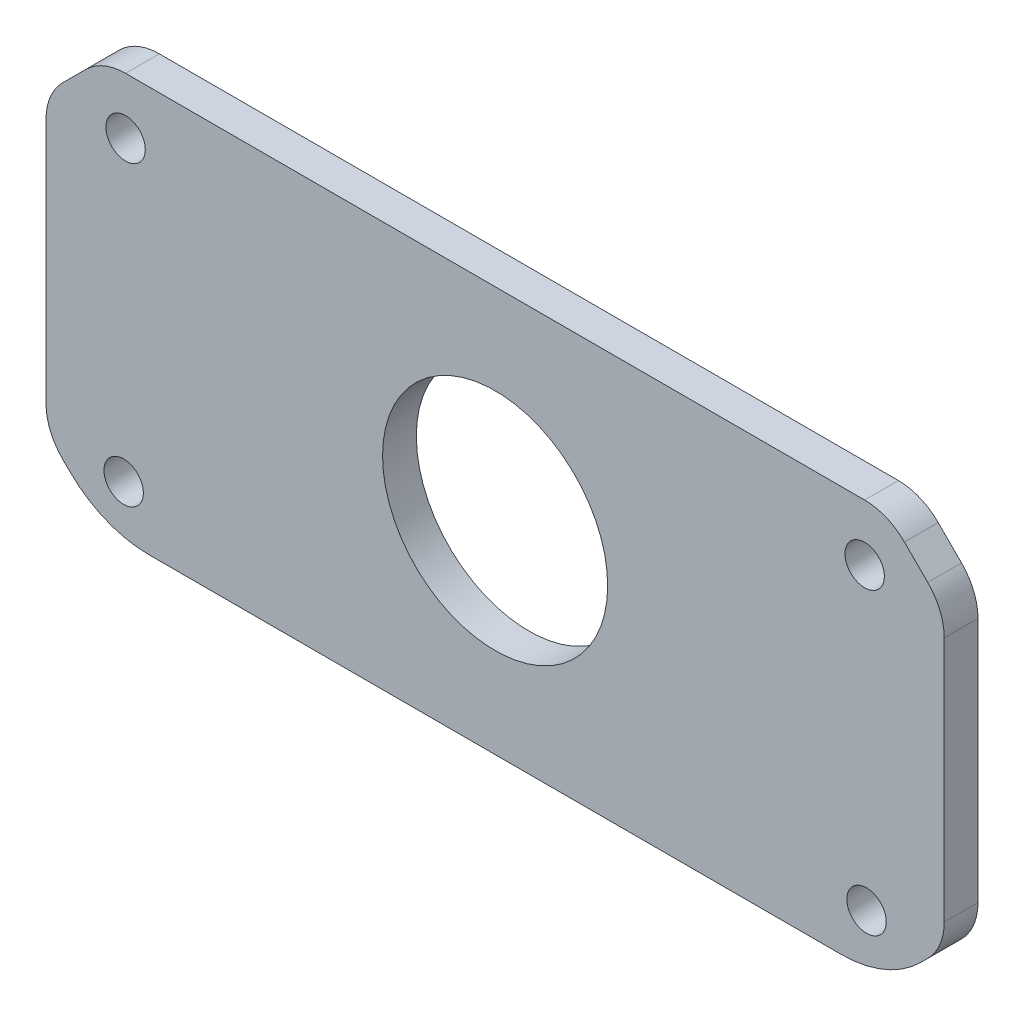
ISO-10303-21;
HEADER;
FILE_DESCRIPTION(('STEP AP214'),'2;1');
FILE_NAME('part.step','',(''),(''),'','','');
FILE_SCHEMA(('AUTOMOTIVE_DESIGN { 1 0 10303 214 1 1 1 1 }'));
ENDSEC;
DATA;
#1=APPLICATION_CONTEXT('core data for automotive mechanical design processes');
#2=APPLICATION_PROTOCOL_DEFINITION('international standard','automotive_design',2000,#1);
#3=PRODUCT_CONTEXT('',#1,'mechanical');
#4=PRODUCT('Part','Part','',(#3));
#5=PRODUCT_RELATED_PRODUCT_CATEGORY('part','',(#4));
#6=PRODUCT_DEFINITION_FORMATION('','',#4);
#7=PRODUCT_DEFINITION_CONTEXT('part definition',#1,'design');
#8=PRODUCT_DEFINITION('design','',#6,#7);
#9=PRODUCT_DEFINITION_SHAPE('','',#8);
#10=(LENGTH_UNIT() NAMED_UNIT(*) SI_UNIT(.MILLI.,.METRE.));
#11=(NAMED_UNIT(*) PLANE_ANGLE_UNIT() SI_UNIT($,.RADIAN.));
#12=(NAMED_UNIT(*) SI_UNIT($,.STERADIAN.) SOLID_ANGLE_UNIT());
#13=UNCERTAINTY_MEASURE_WITH_UNIT(LENGTH_MEASURE(1.E-05),#10,'distance_accuracy_value','');
#14=(GEOMETRIC_REPRESENTATION_CONTEXT(3) GLOBAL_UNCERTAINTY_ASSIGNED_CONTEXT((#13)) GLOBAL_UNIT_ASSIGNED_CONTEXT((#10,
#11,#12)) REPRESENTATION_CONTEXT('',''));
#15=CARTESIAN_POINT('',(0.,0.,0.));
#16=DIRECTION('',(0.,0.,1.));
#17=DIRECTION('',(1.,0.,0.));
#18=AXIS2_PLACEMENT_3D('',#15,#16,#17);
#19=CARTESIAN_POINT('',(-34.9,-10.9289321881345,3.));
#20=DIRECTION('',(0.,0.,1.));
#21=DIRECTION('',(1.,0.,0.));
#22=AXIS2_PLACEMENT_3D('',#19,#20,#21);
#23=PLANE('',#22);
#24=CARTESIAN_POINT('',(32.8289321881345,13.,3.));
#25=DIRECTION('',(0.,0.,1.));
#26=DIRECTION('',(-1.,0.,0.));
#27=AXIS2_PLACEMENT_3D('',#24,#25,#26);
#28=CIRCLE('',#27,1.74999999999998);
#29=CARTESIAN_POINT('',(31.0789321881345,13.,3.));
#30=VERTEX_POINT('',#29);
#31=EDGE_CURVE('E681',#30,#30,#28,.T.);
#32=ORIENTED_EDGE('',*,*,#31,.F.);
#33=EDGE_LOOP('',(#32));
#34=FACE_BOUND('',#33,.T.);
#35=CARTESIAN_POINT('',(-33.,-13.5,3.));
#36=DIRECTION('',(0.,0.,1.));
#37=DIRECTION('',(1.,0.,0.));
#38=AXIS2_PLACEMENT_3D('',#35,#36,#37);
#39=CIRCLE('',#38,1.75);
#40=CARTESIAN_POINT('',(-31.25,-13.5,3.));
#41=VERTEX_POINT('',#40);
#42=EDGE_CURVE('E359',#41,#41,#39,.T.);
#43=ORIENTED_EDGE('',*,*,#42,.F.);
#44=EDGE_LOOP('',(#43));
#45=FACE_BOUND('',#44,.T.);
#46=DIRECTION('',(1.,0.,0.));
#47=VECTOR('',#46,1.);
#48=CARTESIAN_POINT('',(-34.9,-18.,3.));
#49=LINE('',#48,#47);
#50=CARTESIAN_POINT('',(-30.757864376269,-18.,3.));
#51=VERTEX_POINT('',#50);
#52=CARTESIAN_POINT('',(30.757864376269,-18.,3.));
#53=VERTEX_POINT('',#52);
#54=EDGE_CURVE('E162',#51,#53,#49,.T.);
#55=ORIENTED_EDGE('',*,*,#54,.T.);
#56=CARTESIAN_POINT('',(30.7578643762691,-8.,3.));
#57=DIRECTION('',(0.,0.,1.));
#58=DIRECTION('',(1.,0.,0.));
#59=AXIS2_PLACEMENT_3D('',#56,#57,#58);
#60=CIRCLE('',#59,10.);
#61=CARTESIAN_POINT('',(37.8289321881345,-15.0710678118655,3.));
#62=VERTEX_POINT('',#61);
#63=EDGE_CURVE('E49',#53,#62,#60,.T.);
#64=ORIENTED_EDGE('',*,*,#63,.T.);
#65=DIRECTION('',(0.707106781186547,0.707106781186548,0.));
#66=VECTOR('',#65,1.);
#67=CARTESIAN_POINT('',(38.4355339059327,-14.4644660940673,3.));
#68=LINE('',#67,#66);
#69=CARTESIAN_POINT('',(38.4355339059327,-14.4644660940673,3.));
#70=VERTEX_POINT('',#69);
#71=EDGE_CURVE('E211',#62,#70,#68,.T.);
#72=ORIENTED_EDGE('',*,*,#71,.T.);
#73=CARTESIAN_POINT('',(34.9,-10.9289321881345,3.));
#74=DIRECTION('',(0.,0.,1.));
#75=DIRECTION('',(1.,0.,0.));
#76=AXIS2_PLACEMENT_3D('',#73,#74,#75);
#77=CIRCLE('',#76,5.);
#78=CARTESIAN_POINT('',(39.9,-10.9289321881345,3.));
#79=VERTEX_POINT('',#78);
#80=EDGE_CURVE('E220',#70,#79,#77,.T.);
#81=ORIENTED_EDGE('',*,*,#80,.T.);
#82=DIRECTION('',(0.,1.,0.));
#83=VECTOR('',#82,1.);
#84=CARTESIAN_POINT('',(39.9,10.9289321881345,3.));
#85=LINE('',#84,#83);
#86=CARTESIAN_POINT('',(39.9,10.9289321881345,3.));
#87=VERTEX_POINT('',#86);
#88=EDGE_CURVE('E312',#79,#87,#85,.T.);
#89=ORIENTED_EDGE('',*,*,#88,.T.);
#90=CARTESIAN_POINT('',(34.9,10.9289321881345,3.));
#91=DIRECTION('',(0.,0.,1.));
#92=DIRECTION('',(1.,0.,0.));
#93=AXIS2_PLACEMENT_3D('',#90,#91,#92);
#94=CIRCLE('',#93,5.);
#95=CARTESIAN_POINT('',(38.4355339059327,14.4644660940673,3.));
#96=VERTEX_POINT('',#95);
#97=EDGE_CURVE('E329',#87,#96,#94,.T.);
#98=ORIENTED_EDGE('',*,*,#97,.T.);
#99=DIRECTION('',(-0.707106781186548,0.707106781186547,0.));
#100=VECTOR('',#99,1.);
#101=CARTESIAN_POINT('',(36.3644660940673,16.5355339059327,3.));
#102=LINE('',#101,#100);
#103=CARTESIAN_POINT('',(36.3644660940673,16.5355339059327,3.));
#104=VERTEX_POINT('',#103);
#105=EDGE_CURVE('E325',#96,#104,#102,.T.);
#106=ORIENTED_EDGE('',*,*,#105,.T.);
#107=CARTESIAN_POINT('',(32.8289321881345,13.,3.));
#108=DIRECTION('',(0.,0.,1.));
#109=DIRECTION('',(1.,0.,0.));
#110=AXIS2_PLACEMENT_3D('',#107,#108,#109);
#111=CIRCLE('',#110,5.);
#112=CARTESIAN_POINT('',(32.8289321881345,18.,3.));
#113=VERTEX_POINT('',#112);
#114=EDGE_CURVE('E328',#104,#113,#111,.T.);
#115=ORIENTED_EDGE('',*,*,#114,.T.);
#116=DIRECTION('',(-1.,0.,0.));
#117=VECTOR('',#116,1.);
#118=CARTESIAN_POINT('',(-32.8289321881345,18.,3.));
#119=LINE('',#118,#117);
#120=CARTESIAN_POINT('',(-32.8289321881345,18.,3.));
#121=VERTEX_POINT('',#120);
#122=EDGE_CURVE('E332',#113,#121,#119,.T.);
#123=ORIENTED_EDGE('',*,*,#122,.T.);
#124=CARTESIAN_POINT('',(-32.8289321881345,13.,3.));
#125=DIRECTION('',(0.,0.,1.));
#126=DIRECTION('',(1.,0.,0.));
#127=AXIS2_PLACEMENT_3D('',#124,#125,#126);
#128=CIRCLE('',#127,5.);
#129=CARTESIAN_POINT('',(-36.3644660940673,16.5355339059327,3.));
#130=VERTEX_POINT('',#129);
#131=EDGE_CURVE('E340',#121,#130,#128,.T.);
#132=ORIENTED_EDGE('',*,*,#131,.T.);
#133=DIRECTION('',(-0.707106781186548,-0.707106781186548,0.));
#134=VECTOR('',#133,1.);
#135=CARTESIAN_POINT('',(-38.4355339059327,14.4644660940673,3.));
#136=LINE('',#135,#134);
#137=CARTESIAN_POINT('',(-38.4355339059327,14.4644660940673,3.));
#138=VERTEX_POINT('',#137);
#139=EDGE_CURVE('E343',#130,#138,#136,.T.);
#140=ORIENTED_EDGE('',*,*,#139,.T.);
#141=CARTESIAN_POINT('',(-34.9,10.9289321881345,3.));
#142=DIRECTION('',(0.,0.,1.));
#143=DIRECTION('',(1.,0.,0.));
#144=AXIS2_PLACEMENT_3D('',#141,#142,#143);
#145=CIRCLE('',#144,5.);
#146=CARTESIAN_POINT('',(-39.9,10.9289321881345,3.));
#147=VERTEX_POINT('',#146);
#148=EDGE_CURVE('E346',#138,#147,#145,.T.);
#149=ORIENTED_EDGE('',*,*,#148,.T.);
#150=DIRECTION('',(0.,-1.,0.));
#151=VECTOR('',#150,1.);
#152=CARTESIAN_POINT('',(-39.9,-10.9289321881345,3.));
#153=LINE('',#152,#151);
#154=CARTESIAN_POINT('',(-39.9,-10.9289321881345,3.));
#155=VERTEX_POINT('',#154);
#156=EDGE_CURVE('E168',#147,#155,#153,.T.);
#157=ORIENTED_EDGE('',*,*,#156,.T.);
#158=CARTESIAN_POINT('',(-34.9,-10.9289321881345,3.));
#159=DIRECTION('',(0.,0.,1.));
#160=DIRECTION('',(1.,0.,0.));
#161=AXIS2_PLACEMENT_3D('',#158,#159,#160);
#162=CIRCLE('',#161,5.);
#163=CARTESIAN_POINT('',(-38.4355339059327,-14.4644660940673,3.));
#164=VERTEX_POINT('',#163);
#165=EDGE_CURVE('E163',#155,#164,#162,.T.);
#166=ORIENTED_EDGE('',*,*,#165,.T.);
#167=DIRECTION('',(0.707106781186547,-0.707106781186547,0.));
#168=VECTOR('',#167,1.);
#169=CARTESIAN_POINT('',(-34.9,-18.,3.));
#170=LINE('',#169,#168);
#171=CARTESIAN_POINT('',(-37.8289321881345,-15.0710678118655,3.));
#172=VERTEX_POINT('',#171);
#173=EDGE_CURVE('E153',#164,#172,#170,.T.);
#174=ORIENTED_EDGE('',*,*,#173,.T.);
#175=CARTESIAN_POINT('',(-30.757864376269,-7.99999999999999,3.));
#176=DIRECTION('',(0.,0.,1.));
#177=DIRECTION('',(1.,0.,0.));
#178=AXIS2_PLACEMENT_3D('',#175,#176,#177);
#179=CIRCLE('',#178,10.);
#180=EDGE_CURVE('E205',#172,#51,#179,.T.);
#181=ORIENTED_EDGE('',*,*,#180,.T.);
#182=EDGE_LOOP('',(#55,#64,#72,#81,#89,#98,#106,#115,#123,#132,#140,#149,#157,#166,#174,#181));
#183=FACE_BOUND('',#182,.T.);
#184=CARTESIAN_POINT('',(-32.8289321881345,13.,3.));
#185=DIRECTION('',(0.,0.,1.));
#186=DIRECTION('',(1.,0.,0.));
#187=AXIS2_PLACEMENT_3D('',#184,#185,#186);
#188=CIRCLE('',#187,1.75);
#189=CARTESIAN_POINT('',(-31.0789321881345,13.,3.));
#190=VERTEX_POINT('',#189);
#191=EDGE_CURVE('E351',#190,#190,#188,.T.);
#192=ORIENTED_EDGE('',*,*,#191,.F.);
#193=EDGE_LOOP('',(#192));
#194=FACE_BOUND('',#193,.T.);
#195=CARTESIAN_POINT('',(33.,-13.5000000000001,3.));
#196=DIRECTION('',(0.,0.,1.));
#197=DIRECTION('',(-1.,0.,0.));
#198=AXIS2_PLACEMENT_3D('',#195,#196,#197);
#199=CIRCLE('',#198,1.74999999999999);
#200=CARTESIAN_POINT('',(31.25,-13.5000000000001,3.));
#201=VERTEX_POINT('',#200);
#202=EDGE_CURVE('E687',#201,#201,#199,.T.);
#203=ORIENTED_EDGE('',*,*,#202,.F.);
#204=EDGE_LOOP('',(#203));
#205=FACE_BOUND('',#204,.T.);
#206=CARTESIAN_POINT('',(0.,0.,3.));
#207=DIRECTION('',(0.,0.,1.));
#208=DIRECTION('',(1.,0.,0.));
#209=AXIS2_PLACEMENT_3D('',#206,#207,#208);
#210=CIRCLE('',#209,10.);
#211=CARTESIAN_POINT('',(10.,0.,3.));
#212=VERTEX_POINT('',#211);
#213=EDGE_CURVE('E670',#212,#212,#210,.T.);
#214=ORIENTED_EDGE('',*,*,#213,.F.);
#215=EDGE_LOOP('',(#214));
#216=FACE_BOUND('',#215,.T.);
#217=ADVANCED_FACE('F40',(#34,#45,#183,#194,#205,#216),#23,.T.);
#218=CARTESIAN_POINT('',(-34.9,-10.9289321881345,0.));
#219=DIRECTION('',(0.,0.,1.));
#220=DIRECTION('',(1.,0.,0.));
#221=AXIS2_PLACEMENT_3D('',#218,#219,#220);
#222=PLANE('',#221);
#223=DIRECTION('',(0.707106781186547,0.707106781186548,0.));
#224=VECTOR('',#223,1.);
#225=CARTESIAN_POINT('',(38.4355339059327,-14.4644660940673,0.));
#226=LINE('',#225,#224);
#227=CARTESIAN_POINT('',(37.8289321881345,-15.0710678118655,0.));
#228=VERTEX_POINT('',#227);
#229=CARTESIAN_POINT('',(38.4355339059327,-14.4644660940673,0.));
#230=VERTEX_POINT('',#229);
#231=EDGE_CURVE('E229',#228,#230,#226,.T.);
#232=ORIENTED_EDGE('',*,*,#231,.F.);
#233=CARTESIAN_POINT('',(30.7578643762691,-8.,0.));
#234=DIRECTION('',(0.,0.,1.));
#235=DIRECTION('',(1.,0.,0.));
#236=AXIS2_PLACEMENT_3D('',#233,#234,#235);
#237=CIRCLE('',#236,10.);
#238=CARTESIAN_POINT('',(30.7578643762691,-18.,0.));
#239=VERTEX_POINT('',#238);
#240=EDGE_CURVE('E196',#228,#239,#237,.F.);
#241=ORIENTED_EDGE('',*,*,#240,.T.);
#242=DIRECTION('',(1.,0.,0.));
#243=VECTOR('',#242,1.);
#244=CARTESIAN_POINT('',(8.1,-18.,0.));
#245=LINE('',#244,#243);
#246=CARTESIAN_POINT('',(-30.757864376269,-18.,0.));
#247=VERTEX_POINT('',#246);
#248=EDGE_CURVE('E227',#247,#239,#245,.T.);
#249=ORIENTED_EDGE('',*,*,#248,.F.);
#250=CARTESIAN_POINT('',(-30.757864376269,-7.99999999999999,0.));
#251=DIRECTION('',(0.,0.,1.));
#252=DIRECTION('',(1.,0.,0.));
#253=AXIS2_PLACEMENT_3D('',#250,#251,#252);
#254=CIRCLE('',#253,10.);
#255=CARTESIAN_POINT('',(-37.8289321881345,-15.0710678118655,0.));
#256=VERTEX_POINT('',#255);
#257=EDGE_CURVE('E186',#247,#256,#254,.F.);
#258=ORIENTED_EDGE('',*,*,#257,.T.);
#259=DIRECTION('',(0.707106781186547,-0.707106781186547,0.));
#260=VECTOR('',#259,1.);
#261=CARTESIAN_POINT('',(-34.9,-18.,0.));
#262=LINE('',#261,#260);
#263=CARTESIAN_POINT('',(-38.4355339059327,-14.4644660940673,0.));
#264=VERTEX_POINT('',#263);
#265=EDGE_CURVE('E233',#264,#256,#262,.T.);
#266=ORIENTED_EDGE('',*,*,#265,.F.);
#267=CARTESIAN_POINT('',(-34.9,-10.9289321881345,0.));
#268=DIRECTION('',(0.,0.,1.));
#269=DIRECTION('',(1.,0.,0.));
#270=AXIS2_PLACEMENT_3D('',#267,#268,#269);
#271=CIRCLE('',#270,5.);
#272=CARTESIAN_POINT('',(-39.9,-10.9289321881345,0.));
#273=VERTEX_POINT('',#272);
#274=EDGE_CURVE('E177',#273,#264,#271,.T.);
#275=ORIENTED_EDGE('',*,*,#274,.F.);
#276=DIRECTION('',(0.,-1.,0.));
#277=VECTOR('',#276,1.);
#278=CARTESIAN_POINT('',(-39.9,-10.9289321881345,0.));
#279=LINE('',#278,#277);
#280=CARTESIAN_POINT('',(-39.9,10.9289321881345,0.));
#281=VERTEX_POINT('',#280);
#282=EDGE_CURVE('E173',#281,#273,#279,.T.);
#283=ORIENTED_EDGE('',*,*,#282,.F.);
#284=CARTESIAN_POINT('',(-34.9,10.9289321881345,0.));
#285=DIRECTION('',(0.,0.,1.));
#286=DIRECTION('',(1.,0.,0.));
#287=AXIS2_PLACEMENT_3D('',#284,#285,#286);
#288=CIRCLE('',#287,5.);
#289=CARTESIAN_POINT('',(-38.4355339059327,14.4644660940673,0.));
#290=VERTEX_POINT('',#289);
#291=EDGE_CURVE('E266',#290,#281,#288,.T.);
#292=ORIENTED_EDGE('',*,*,#291,.F.);
#293=DIRECTION('',(-0.707106781186548,-0.707106781186548,0.));
#294=VECTOR('',#293,1.);
#295=CARTESIAN_POINT('',(-38.4355339059327,14.4644660940673,0.));
#296=LINE('',#295,#294);
#297=CARTESIAN_POINT('',(-36.3644660940673,16.5355339059327,0.));
#298=VERTEX_POINT('',#297);
#299=EDGE_CURVE('E263',#298,#290,#296,.T.);
#300=ORIENTED_EDGE('',*,*,#299,.F.);
#301=CARTESIAN_POINT('',(-32.8289321881345,13.,0.));
#302=DIRECTION('',(0.,0.,1.));
#303=DIRECTION('',(1.,0.,0.));
#304=AXIS2_PLACEMENT_3D('',#301,#302,#303);
#305=CIRCLE('',#304,5.);
#306=CARTESIAN_POINT('',(-32.8289321881345,18.,0.));
#307=VERTEX_POINT('',#306);
#308=EDGE_CURVE('E260',#307,#298,#305,.T.);
#309=ORIENTED_EDGE('',*,*,#308,.F.);
#310=DIRECTION('',(-1.,0.,0.));
#311=VECTOR('',#310,1.);
#312=CARTESIAN_POINT('',(-32.8289321881345,18.,0.));
#313=LINE('',#312,#311);
#314=CARTESIAN_POINT('',(32.8289321881345,18.,0.));
#315=VERTEX_POINT('',#314);
#316=EDGE_CURVE('E258',#315,#307,#313,.T.);
#317=ORIENTED_EDGE('',*,*,#316,.F.);
#318=CARTESIAN_POINT('',(32.8289321881345,13.,0.));
#319=DIRECTION('',(0.,0.,1.));
#320=DIRECTION('',(1.,0.,0.));
#321=AXIS2_PLACEMENT_3D('',#318,#319,#320);
#322=CIRCLE('',#321,5.);
#323=CARTESIAN_POINT('',(36.3644660940673,16.5355339059327,0.));
#324=VERTEX_POINT('',#323);
#325=EDGE_CURVE('E255',#324,#315,#322,.T.);
#326=ORIENTED_EDGE('',*,*,#325,.F.);
#327=DIRECTION('',(-0.707106781186548,0.707106781186547,0.));
#328=VECTOR('',#327,1.);
#329=CARTESIAN_POINT('',(36.3644660940673,16.5355339059327,0.));
#330=LINE('',#329,#328);
#331=CARTESIAN_POINT('',(38.4355339059327,14.4644660940673,0.));
#332=VERTEX_POINT('',#331);
#333=EDGE_CURVE('E252',#332,#324,#330,.T.);
#334=ORIENTED_EDGE('',*,*,#333,.F.);
#335=CARTESIAN_POINT('',(34.9,10.9289321881345,0.));
#336=DIRECTION('',(0.,0.,1.));
#337=DIRECTION('',(1.,0.,0.));
#338=AXIS2_PLACEMENT_3D('',#335,#336,#337);
#339=CIRCLE('',#338,5.);
#340=CARTESIAN_POINT('',(39.9,10.9289321881345,0.));
#341=VERTEX_POINT('',#340);
#342=EDGE_CURVE('E249',#341,#332,#339,.T.);
#343=ORIENTED_EDGE('',*,*,#342,.F.);
#344=DIRECTION('',(0.,1.,0.));
#345=VECTOR('',#344,1.);
#346=CARTESIAN_POINT('',(39.9,10.9289321881345,0.));
#347=LINE('',#346,#345);
#348=CARTESIAN_POINT('',(39.9,-10.9289321881345,0.));
#349=VERTEX_POINT('',#348);
#350=EDGE_CURVE('E246',#349,#341,#347,.T.);
#351=ORIENTED_EDGE('',*,*,#350,.F.);
#352=CARTESIAN_POINT('',(34.9,-10.9289321881345,0.));
#353=DIRECTION('',(0.,0.,1.));
#354=DIRECTION('',(1.,0.,0.));
#355=AXIS2_PLACEMENT_3D('',#352,#353,#354);
#356=CIRCLE('',#355,5.);
#357=EDGE_CURVE('E238',#230,#349,#356,.T.);
#358=ORIENTED_EDGE('',*,*,#357,.F.);
#359=EDGE_LOOP('',(#232,#241,#249,#258,#266,#275,#283,#292,#300,#309,#317,#326,#334,#343,#351,#358));
#360=FACE_BOUND('',#359,.T.);
#361=CARTESIAN_POINT('',(-32.8289321881345,13.,0.));
#362=DIRECTION('',(0.,0.,1.));
#363=DIRECTION('',(1.,0.,0.));
#364=AXIS2_PLACEMENT_3D('',#361,#362,#363);
#365=CIRCLE('',#364,1.75);
#366=CARTESIAN_POINT('',(-31.0789321881345,13.,0.));
#367=VERTEX_POINT('',#366);
#368=EDGE_CURVE('E353',#367,#367,#365,.T.);
#369=ORIENTED_EDGE('',*,*,#368,.T.);
#370=EDGE_LOOP('',(#369));
#371=FACE_BOUND('',#370,.T.);
#372=CARTESIAN_POINT('',(-33.,-13.5,0.));
#373=DIRECTION('',(0.,0.,1.));
#374=DIRECTION('',(1.,0.,0.));
#375=AXIS2_PLACEMENT_3D('',#372,#373,#374);
#376=CIRCLE('',#375,1.75);
#377=CARTESIAN_POINT('',(-31.25,-13.5,0.));
#378=VERTEX_POINT('',#377);
#379=EDGE_CURVE('E362',#378,#378,#376,.T.);
#380=ORIENTED_EDGE('',*,*,#379,.T.);
#381=EDGE_LOOP('',(#380));
#382=FACE_BOUND('',#381,.T.);
#383=CARTESIAN_POINT('',(33.,-13.5000000000001,0.));
#384=DIRECTION('',(0.,0.,1.));
#385=DIRECTION('',(-1.,0.,0.));
#386=AXIS2_PLACEMENT_3D('',#383,#384,#385);
#387=CIRCLE('',#386,1.74999999999999);
#388=CARTESIAN_POINT('',(31.25,-13.5000000000001,0.));
#389=VERTEX_POINT('',#388);
#390=EDGE_CURVE('E684',#389,#389,#387,.T.);
#391=ORIENTED_EDGE('',*,*,#390,.T.);
#392=EDGE_LOOP('',(#391));
#393=FACE_BOUND('',#392,.T.);
#394=CARTESIAN_POINT('',(32.8289321881345,13.,0.));
#395=DIRECTION('',(0.,0.,1.));
#396=DIRECTION('',(-1.,0.,0.));
#397=AXIS2_PLACEMENT_3D('',#394,#395,#396);
#398=CIRCLE('',#397,1.74999999999998);
#399=CARTESIAN_POINT('',(31.0789321881345,13.,0.));
#400=VERTEX_POINT('',#399);
#401=EDGE_CURVE('E678',#400,#400,#398,.T.);
#402=ORIENTED_EDGE('',*,*,#401,.T.);
#403=EDGE_LOOP('',(#402));
#404=FACE_BOUND('',#403,.T.);
#405=CARTESIAN_POINT('',(0.,0.,0.));
#406=DIRECTION('',(0.,0.,1.));
#407=DIRECTION('',(1.,0.,0.));
#408=AXIS2_PLACEMENT_3D('',#405,#406,#407);
#409=CIRCLE('',#408,10.);
#410=CARTESIAN_POINT('',(10.,0.,0.));
#411=VERTEX_POINT('',#410);
#412=EDGE_CURVE('E673',#411,#411,#409,.T.);
#413=ORIENTED_EDGE('',*,*,#412,.T.);
#414=EDGE_LOOP('',(#413));
#415=FACE_BOUND('',#414,.T.);
#416=ADVANCED_FACE('F225',(#360,#371,#382,#393,#404,#415),#222,.F.);
#417=CARTESIAN_POINT('',(-34.9,-10.9289321881345,3.));
#418=DIRECTION('',(0.,0.,-1.));
#419=DIRECTION('',(-1.,0.,0.));
#420=AXIS2_PLACEMENT_3D('',#417,#418,#419);
#421=CYLINDRICAL_SURFACE('',#420,5.);
#422=ORIENTED_EDGE('',*,*,#274,.T.);
#423=DIRECTION('',(0.,0.,-1.));
#424=VECTOR('',#423,1.);
#425=CARTESIAN_POINT('',(-38.4355339059327,-14.4644660940673,3.));
#426=LINE('',#425,#424);
#427=EDGE_CURVE('E157',#164,#264,#426,.T.);
#428=ORIENTED_EDGE('',*,*,#427,.F.);
#429=ORIENTED_EDGE('',*,*,#165,.F.);
#430=DIRECTION('',(0.,0.,-1.));
#431=VECTOR('',#430,1.);
#432=CARTESIAN_POINT('',(-39.9,-10.9289321881345,3.));
#433=LINE('',#432,#431);
#434=EDGE_CURVE('E271',#155,#273,#433,.T.);
#435=ORIENTED_EDGE('',*,*,#434,.T.);
#436=EDGE_LOOP('',(#422,#428,#429,#435));
#437=FACE_BOUND('',#436,.T.);
#438=ADVANCED_FACE('F175',(#437),#421,.T.);
#439=CARTESIAN_POINT('',(-34.9,-18.,3.));
#440=DIRECTION('',(0.707106781186548,0.707106781186548,0.));
#441=DIRECTION('',(-0.707106781186548,0.707106781186548,0.));
#442=AXIS2_PLACEMENT_3D('',#439,#440,#441);
#443=PLANE('',#442);
#444=ORIENTED_EDGE('',*,*,#265,.T.);
#445=DIRECTION('',(0.,0.,-1.));
#446=VECTOR('',#445,1.);
#447=CARTESIAN_POINT('',(-37.8289321881345,-15.0710678118655,3.));
#448=LINE('',#447,#446);
#449=EDGE_CURVE('E11',#256,#172,#448,.F.);
#450=ORIENTED_EDGE('',*,*,#449,.T.);
#451=ORIENTED_EDGE('',*,*,#173,.F.);
#452=ORIENTED_EDGE('',*,*,#427,.T.);
#453=EDGE_LOOP('',(#444,#450,#451,#452));
#454=FACE_BOUND('',#453,.T.);
#455=ADVANCED_FACE('F155',(#454),#443,.F.);
#456=CARTESIAN_POINT('',(8.1,-18.,3.));
#457=DIRECTION('',(0.,1.,0.));
#458=DIRECTION('',(-1.,0.,0.));
#459=AXIS2_PLACEMENT_3D('',#456,#457,#458);
#460=PLANE('',#459);
#461=ORIENTED_EDGE('',*,*,#248,.T.);
#462=DIRECTION('',(0.,0.,-1.));
#463=VECTOR('',#462,1.);
#464=CARTESIAN_POINT('',(30.7578643762691,-18.,3.));
#465=LINE('',#464,#463);
#466=EDGE_CURVE('E62',#239,#53,#465,.F.);
#467=ORIENTED_EDGE('',*,*,#466,.T.);
#468=ORIENTED_EDGE('',*,*,#54,.F.);
#469=DIRECTION('',(0.,0.,-1.));
#470=VECTOR('',#469,1.);
#471=CARTESIAN_POINT('',(-30.757864376269,-18.,3.));
#472=LINE('',#471,#470);
#473=EDGE_CURVE('E199',#51,#247,#472,.T.);
#474=ORIENTED_EDGE('',*,*,#473,.T.);
#475=EDGE_LOOP('',(#461,#467,#468,#474));
#476=FACE_BOUND('',#475,.T.);
#477=ADVANCED_FACE('F230',(#476),#460,.F.);
#478=CARTESIAN_POINT('',(38.4355339059327,-14.4644660940673,3.));
#479=DIRECTION('',(-0.707106781186548,0.707106781186547,0.));
#480=DIRECTION('',(-0.707106781186547,-0.707106781186548,0.));
#481=AXIS2_PLACEMENT_3D('',#478,#479,#480);
#482=PLANE('',#481);
#483=ORIENTED_EDGE('',*,*,#71,.F.);
#484=DIRECTION('',(0.,0.,-1.));
#485=VECTOR('',#484,1.);
#486=CARTESIAN_POINT('',(37.8289321881345,-15.0710678118655,3.));
#487=LINE('',#486,#485);
#488=EDGE_CURVE('E179',#62,#228,#487,.T.);
#489=ORIENTED_EDGE('',*,*,#488,.T.);
#490=ORIENTED_EDGE('',*,*,#231,.T.);
#491=DIRECTION('',(0.,0.,-1.));
#492=VECTOR('',#491,1.);
#493=CARTESIAN_POINT('',(38.4355339059327,-14.4644660940673,3.));
#494=LINE('',#493,#492);
#495=EDGE_CURVE('E180',#70,#230,#494,.T.);
#496=ORIENTED_EDGE('',*,*,#495,.F.);
#497=EDGE_LOOP('',(#483,#489,#490,#496));
#498=FACE_BOUND('',#497,.T.);
#499=ADVANCED_FACE('F216',(#498),#482,.F.);
#500=CARTESIAN_POINT('',(34.9,-10.9289321881345,3.));
#501=DIRECTION('',(0.,0.,-1.));
#502=DIRECTION('',(-1.,0.,0.));
#503=AXIS2_PLACEMENT_3D('',#500,#501,#502);
#504=CYLINDRICAL_SURFACE('',#503,5.);
#505=ORIENTED_EDGE('',*,*,#357,.T.);
#506=DIRECTION('',(0.,0.,-1.));
#507=VECTOR('',#506,1.);
#508=CARTESIAN_POINT('',(39.9,-10.9289321881345,3.));
#509=LINE('',#508,#507);
#510=EDGE_CURVE('E190',#79,#349,#509,.T.);
#511=ORIENTED_EDGE('',*,*,#510,.F.);
#512=ORIENTED_EDGE('',*,*,#80,.F.);
#513=ORIENTED_EDGE('',*,*,#495,.T.);
#514=EDGE_LOOP('',(#505,#511,#512,#513));
#515=FACE_BOUND('',#514,.T.);
#516=ADVANCED_FACE('F370',(#515),#504,.T.);
#517=CARTESIAN_POINT('',(39.9,10.9289321881345,3.));
#518=DIRECTION('',(-1.,0.,0.));
#519=DIRECTION('',(0.,-1.,0.));
#520=AXIS2_PLACEMENT_3D('',#517,#518,#519);
#521=PLANE('',#520);
#522=ORIENTED_EDGE('',*,*,#350,.T.);
#523=DIRECTION('',(0.,0.,-1.));
#524=VECTOR('',#523,1.);
#525=CARTESIAN_POINT('',(39.9,10.9289321881345,3.));
#526=LINE('',#525,#524);
#527=EDGE_CURVE('E300',#87,#341,#526,.T.);
#528=ORIENTED_EDGE('',*,*,#527,.F.);
#529=ORIENTED_EDGE('',*,*,#88,.F.);
#530=ORIENTED_EDGE('',*,*,#510,.T.);
#531=EDGE_LOOP('',(#522,#528,#529,#530));
#532=FACE_BOUND('',#531,.T.);
#533=ADVANCED_FACE('F310',(#532),#521,.F.);
#534=CARTESIAN_POINT('',(34.9,10.9289321881345,3.));
#535=DIRECTION('',(0.,0.,-1.));
#536=DIRECTION('',(-1.,0.,0.));
#537=AXIS2_PLACEMENT_3D('',#534,#535,#536);
#538=CYLINDRICAL_SURFACE('',#537,5.);
#539=ORIENTED_EDGE('',*,*,#342,.T.);
#540=DIRECTION('',(0.,0.,-1.));
#541=VECTOR('',#540,1.);
#542=CARTESIAN_POINT('',(38.4355339059327,14.4644660940673,3.));
#543=LINE('',#542,#541);
#544=EDGE_CURVE('E296',#96,#332,#543,.T.);
#545=ORIENTED_EDGE('',*,*,#544,.F.);
#546=ORIENTED_EDGE('',*,*,#97,.F.);
#547=ORIENTED_EDGE('',*,*,#527,.T.);
#548=EDGE_LOOP('',(#539,#545,#546,#547));
#549=FACE_BOUND('',#548,.T.);
#550=ADVANCED_FACE('F319',(#549),#538,.T.);
#551=CARTESIAN_POINT('',(36.3644660940673,16.5355339059327,3.));
#552=DIRECTION('',(-0.707106781186547,-0.707106781186548,0.));
#553=DIRECTION('',(0.707106781186548,-0.707106781186547,0.));
#554=AXIS2_PLACEMENT_3D('',#551,#552,#553);
#555=PLANE('',#554);
#556=ORIENTED_EDGE('',*,*,#333,.T.);
#557=DIRECTION('',(0.,0.,-1.));
#558=VECTOR('',#557,1.);
#559=CARTESIAN_POINT('',(36.3644660940673,16.5355339059327,3.));
#560=LINE('',#559,#558);
#561=EDGE_CURVE('E292',#104,#324,#560,.T.);
#562=ORIENTED_EDGE('',*,*,#561,.F.);
#563=ORIENTED_EDGE('',*,*,#105,.F.);
#564=ORIENTED_EDGE('',*,*,#544,.T.);
#565=EDGE_LOOP('',(#556,#562,#563,#564));
#566=FACE_BOUND('',#565,.T.);
#567=ADVANCED_FACE('F323',(#566),#555,.F.);
#568=CARTESIAN_POINT('',(32.8289321881345,13.,3.));
#569=DIRECTION('',(0.,0.,-1.));
#570=DIRECTION('',(-1.,0.,0.));
#571=AXIS2_PLACEMENT_3D('',#568,#569,#570);
#572=CYLINDRICAL_SURFACE('',#571,5.);
#573=ORIENTED_EDGE('',*,*,#325,.T.);
#574=DIRECTION('',(0.,0.,-1.));
#575=VECTOR('',#574,1.);
#576=CARTESIAN_POINT('',(32.8289321881345,18.,3.));
#577=LINE('',#576,#575);
#578=EDGE_CURVE('E289',#113,#315,#577,.T.);
#579=ORIENTED_EDGE('',*,*,#578,.F.);
#580=ORIENTED_EDGE('',*,*,#114,.F.);
#581=ORIENTED_EDGE('',*,*,#561,.T.);
#582=EDGE_LOOP('',(#573,#579,#580,#581));
#583=FACE_BOUND('',#582,.T.);
#584=ADVANCED_FACE('F411',(#583),#572,.T.);
#585=CARTESIAN_POINT('',(-32.8289321881345,18.,3.));
#586=DIRECTION('',(0.,-1.,0.));
#587=DIRECTION('',(1.,0.,0.));
#588=AXIS2_PLACEMENT_3D('',#585,#586,#587);
#589=PLANE('',#588);
#590=ORIENTED_EDGE('',*,*,#316,.T.);
#591=DIRECTION('',(0.,0.,-1.));
#592=VECTOR('',#591,1.);
#593=CARTESIAN_POINT('',(-32.8289321881345,18.,3.));
#594=LINE('',#593,#592);
#595=EDGE_CURVE('E285',#121,#307,#594,.T.);
#596=ORIENTED_EDGE('',*,*,#595,.F.);
#597=ORIENTED_EDGE('',*,*,#122,.F.);
#598=ORIENTED_EDGE('',*,*,#578,.T.);
#599=EDGE_LOOP('',(#590,#596,#597,#598));
#600=FACE_BOUND('',#599,.T.);
#601=ADVANCED_FACE('F407',(#600),#589,.F.);
#602=CARTESIAN_POINT('',(-32.8289321881345,13.,3.));
#603=DIRECTION('',(0.,0.,-1.));
#604=DIRECTION('',(-1.,0.,0.));
#605=AXIS2_PLACEMENT_3D('',#602,#603,#604);
#606=CYLINDRICAL_SURFACE('',#605,5.);
#607=ORIENTED_EDGE('',*,*,#308,.T.);
#608=DIRECTION('',(0.,0.,-1.));
#609=VECTOR('',#608,1.);
#610=CARTESIAN_POINT('',(-36.3644660940673,16.5355339059327,3.));
#611=LINE('',#610,#609);
#612=EDGE_CURVE('E281',#130,#298,#611,.T.);
#613=ORIENTED_EDGE('',*,*,#612,.F.);
#614=ORIENTED_EDGE('',*,*,#131,.F.);
#615=ORIENTED_EDGE('',*,*,#595,.T.);
#616=EDGE_LOOP('',(#607,#613,#614,#615));
#617=FACE_BOUND('',#616,.T.);
#618=ADVANCED_FACE('F403',(#617),#606,.T.);
#619=CARTESIAN_POINT('',(-38.4355339059327,14.4644660940673,3.));
#620=DIRECTION('',(0.707106781186547,-0.707106781186547,0.));
#621=DIRECTION('',(0.707106781186548,0.707106781186548,0.));
#622=AXIS2_PLACEMENT_3D('',#619,#620,#621);
#623=PLANE('',#622);
#624=ORIENTED_EDGE('',*,*,#299,.T.);
#625=DIRECTION('',(0.,0.,-1.));
#626=VECTOR('',#625,1.);
#627=CARTESIAN_POINT('',(-38.4355339059327,14.4644660940673,3.));
#628=LINE('',#627,#626);
#629=EDGE_CURVE('E277',#138,#290,#628,.T.);
#630=ORIENTED_EDGE('',*,*,#629,.F.);
#631=ORIENTED_EDGE('',*,*,#139,.F.);
#632=ORIENTED_EDGE('',*,*,#612,.T.);
#633=EDGE_LOOP('',(#624,#630,#631,#632));
#634=FACE_BOUND('',#633,.T.);
#635=ADVANCED_FACE('F399',(#634),#623,.F.);
#636=CARTESIAN_POINT('',(-34.9,10.9289321881345,3.));
#637=DIRECTION('',(0.,0.,-1.));
#638=DIRECTION('',(-1.,0.,0.));
#639=AXIS2_PLACEMENT_3D('',#636,#637,#638);
#640=CYLINDRICAL_SURFACE('',#639,5.);
#641=ORIENTED_EDGE('',*,*,#291,.T.);
#642=DIRECTION('',(0.,0.,-1.));
#643=VECTOR('',#642,1.);
#644=CARTESIAN_POINT('',(-39.9,10.9289321881345,3.));
#645=LINE('',#644,#643);
#646=EDGE_CURVE('E274',#147,#281,#645,.T.);
#647=ORIENTED_EDGE('',*,*,#646,.F.);
#648=ORIENTED_EDGE('',*,*,#148,.F.);
#649=ORIENTED_EDGE('',*,*,#629,.T.);
#650=EDGE_LOOP('',(#641,#647,#648,#649));
#651=FACE_BOUND('',#650,.T.);
#652=ADVANCED_FACE('F395',(#651),#640,.T.);
#653=CARTESIAN_POINT('',(-39.9,-10.9289321881345,3.));
#654=DIRECTION('',(1.,0.,0.));
#655=DIRECTION('',(0.,0.,-1.));
#656=AXIS2_PLACEMENT_3D('',#653,#654,#655);
#657=PLANE('',#656);
#658=ORIENTED_EDGE('',*,*,#282,.T.);
#659=ORIENTED_EDGE('',*,*,#434,.F.);
#660=ORIENTED_EDGE('',*,*,#156,.F.);
#661=ORIENTED_EDGE('',*,*,#646,.T.);
#662=EDGE_LOOP('',(#658,#659,#660,#661));
#663=FACE_BOUND('',#662,.T.);
#664=ADVANCED_FACE('F392',(#663),#657,.F.);
#665=CARTESIAN_POINT('',(-32.8289321881345,13.,3.));
#666=DIRECTION('',(0.,0.,-1.));
#667=DIRECTION('',(-1.,0.,0.));
#668=AXIS2_PLACEMENT_3D('',#665,#666,#667);
#669=CYLINDRICAL_SURFACE('',#668,1.75);
#670=ORIENTED_EDGE('',*,*,#191,.T.);
#671=EDGE_LOOP('',(#670));
#672=FACE_BOUND('',#671,.T.);
#673=ORIENTED_EDGE('',*,*,#368,.F.);
#674=EDGE_LOOP('',(#673));
#675=FACE_BOUND('',#674,.T.);
#676=ADVANCED_FACE('F389',(#672,#675),#669,.F.);
#677=CARTESIAN_POINT('',(-33.,-13.5,3.));
#678=DIRECTION('',(0.,0.,-1.));
#679=DIRECTION('',(-1.,0.,0.));
#680=AXIS2_PLACEMENT_3D('',#677,#678,#679);
#681=CYLINDRICAL_SURFACE('',#680,1.75);
#682=ORIENTED_EDGE('',*,*,#42,.T.);
#683=EDGE_LOOP('',(#682));
#684=FACE_BOUND('',#683,.T.);
#685=ORIENTED_EDGE('',*,*,#379,.F.);
#686=EDGE_LOOP('',(#685));
#687=FACE_BOUND('',#686,.T.);
#688=ADVANCED_FACE('F449',(#684,#687),#681,.F.);
#689=CARTESIAN_POINT('',(33.,-13.5000000000001,3.));
#690=DIRECTION('',(0.,0.,-1.));
#691=DIRECTION('',(-1.,0.,0.));
#692=AXIS2_PLACEMENT_3D('',#689,#690,#691);
#693=CYLINDRICAL_SURFACE('',#692,1.74999999999999);
#694=ORIENTED_EDGE('',*,*,#202,.T.);
#695=EDGE_LOOP('',(#694));
#696=FACE_BOUND('',#695,.T.);
#697=ORIENTED_EDGE('',*,*,#390,.F.);
#698=EDGE_LOOP('',(#697));
#699=FACE_BOUND('',#698,.T.);
#700=ADVANCED_FACE('F454',(#696,#699),#693,.F.);
#701=CARTESIAN_POINT('',(32.8289321881345,13.,3.));
#702=DIRECTION('',(0.,0.,-1.));
#703=DIRECTION('',(-1.,0.,0.));
#704=AXIS2_PLACEMENT_3D('',#701,#702,#703);
#705=CYLINDRICAL_SURFACE('',#704,1.74999999999998);
#706=ORIENTED_EDGE('',*,*,#31,.T.);
#707=EDGE_LOOP('',(#706));
#708=FACE_BOUND('',#707,.T.);
#709=ORIENTED_EDGE('',*,*,#401,.F.);
#710=EDGE_LOOP('',(#709));
#711=FACE_BOUND('',#710,.T.);
#712=ADVANCED_FACE('F460',(#708,#711),#705,.F.);
#713=CARTESIAN_POINT('',(0.,0.,3.));
#714=DIRECTION('',(0.,0.,-1.));
#715=DIRECTION('',(-1.,0.,0.));
#716=AXIS2_PLACEMENT_3D('',#713,#714,#715);
#717=CYLINDRICAL_SURFACE('',#716,10.);
#718=ORIENTED_EDGE('',*,*,#213,.T.);
#719=EDGE_LOOP('',(#718));
#720=FACE_BOUND('',#719,.T.);
#721=ORIENTED_EDGE('',*,*,#412,.F.);
#722=EDGE_LOOP('',(#721));
#723=FACE_BOUND('',#722,.T.);
#724=ADVANCED_FACE('F467',(#720,#723),#717,.F.);
#725=CARTESIAN_POINT('',(30.7578643762691,-8.,3.));
#726=DIRECTION('',(0.,0.,-1.));
#727=DIRECTION('',(-1.,0.,0.));
#728=AXIS2_PLACEMENT_3D('',#725,#726,#727);
#729=CYLINDRICAL_SURFACE('',#728,10.);
#730=ORIENTED_EDGE('',*,*,#63,.F.);
#731=ORIENTED_EDGE('',*,*,#466,.F.);
#732=ORIENTED_EDGE('',*,*,#240,.F.);
#733=ORIENTED_EDGE('',*,*,#488,.F.);
#734=EDGE_LOOP('',(#730,#731,#732,#733));
#735=FACE_BOUND('',#734,.T.);
#736=ADVANCED_FACE('F222',(#735),#729,.T.);
#737=CARTESIAN_POINT('',(-30.757864376269,-7.99999999999999,3.));
#738=DIRECTION('',(0.,0.,-1.));
#739=DIRECTION('',(-1.,0.,0.));
#740=AXIS2_PLACEMENT_3D('',#737,#738,#739);
#741=CYLINDRICAL_SURFACE('',#740,10.);
#742=ORIENTED_EDGE('',*,*,#180,.F.);
#743=ORIENTED_EDGE('',*,*,#449,.F.);
#744=ORIENTED_EDGE('',*,*,#257,.F.);
#745=ORIENTED_EDGE('',*,*,#473,.F.);
#746=EDGE_LOOP('',(#742,#743,#744,#745));
#747=FACE_BOUND('',#746,.T.);
#748=ADVANCED_FACE('F42',(#747),#741,.T.);
#749=CLOSED_SHELL('',(#217,#416,#438,#455,#477,#499,#516,#533,#550,#567,#584,#601,#618,#635,
#652,#664,#676,#688,#700,#712,#724,#736,#748));
#750=MANIFOLD_SOLID_BREP('B2',#749);
#751=ADVANCED_BREP_SHAPE_REPRESENTATION('',(#18,#750),#14);
#752=SHAPE_DEFINITION_REPRESENTATION(#9,#751);
ENDSEC;
END-ISO-10303-21;
